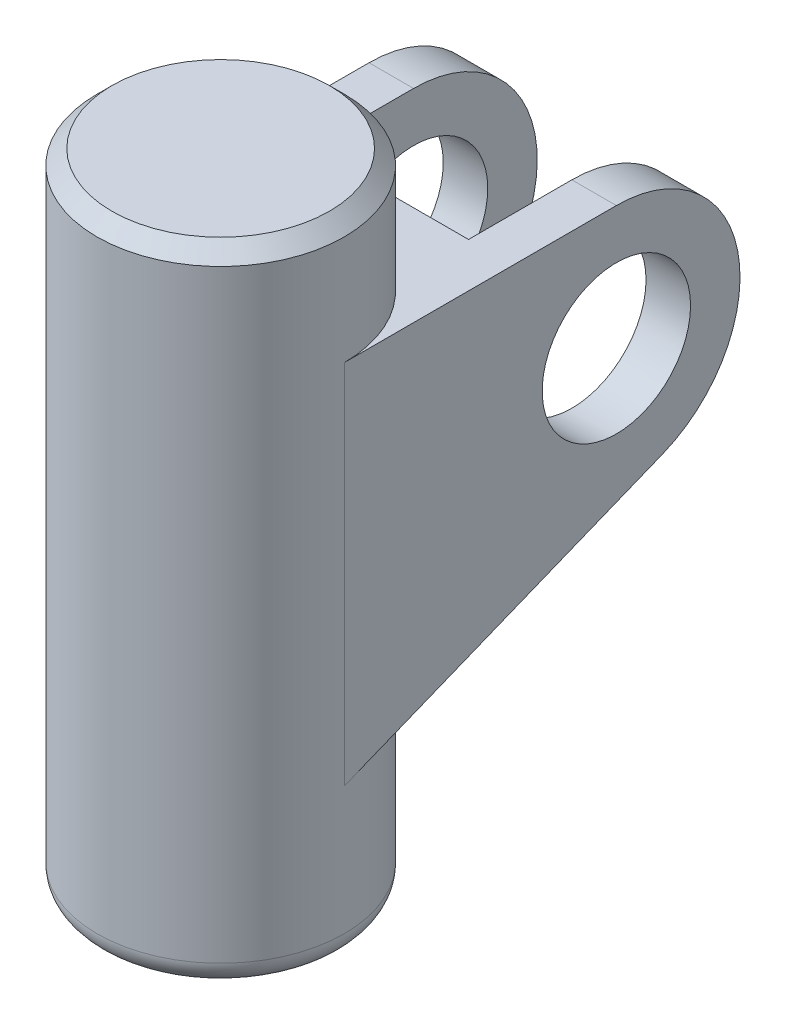
ISO-10303-21;
HEADER;
FILE_DESCRIPTION(('STEP AP214'),'2;1');
FILE_NAME('part.step','',(''),(''),'','','');
FILE_SCHEMA(('AUTOMOTIVE_DESIGN { 1 0 10303 214 1 1 1 1 }'));
ENDSEC;
DATA;
#1=APPLICATION_CONTEXT('core data for automotive mechanical design processes');
#2=APPLICATION_PROTOCOL_DEFINITION('international standard','automotive_design',2000,#1);
#3=PRODUCT_CONTEXT('',#1,'mechanical');
#4=PRODUCT('Part','Part','',(#3));
#5=PRODUCT_RELATED_PRODUCT_CATEGORY('part','',(#4));
#6=PRODUCT_DEFINITION_FORMATION('','',#4);
#7=PRODUCT_DEFINITION_CONTEXT('part definition',#1,'design');
#8=PRODUCT_DEFINITION('design','',#6,#7);
#9=PRODUCT_DEFINITION_SHAPE('','',#8);
#10=(LENGTH_UNIT() NAMED_UNIT(*) SI_UNIT(.MILLI.,.METRE.));
#11=(NAMED_UNIT(*) PLANE_ANGLE_UNIT() SI_UNIT($,.RADIAN.));
#12=(NAMED_UNIT(*) SI_UNIT($,.STERADIAN.) SOLID_ANGLE_UNIT());
#13=UNCERTAINTY_MEASURE_WITH_UNIT(LENGTH_MEASURE(1.E-05),#10,'distance_accuracy_value','');
#14=(GEOMETRIC_REPRESENTATION_CONTEXT(3) GLOBAL_UNCERTAINTY_ASSIGNED_CONTEXT((#13)) GLOBAL_UNIT_ASSIGNED_CONTEXT((#10,
#11,#12)) REPRESENTATION_CONTEXT('',''));
#15=CARTESIAN_POINT('',(0.,0.,0.));
#16=DIRECTION('',(0.,0.,1.));
#17=DIRECTION('',(1.,0.,0.));
#18=AXIS2_PLACEMENT_3D('',#15,#16,#17);
#19=CARTESIAN_POINT('',(25.,0.,0.));
#20=DIRECTION('',(-1.,0.,0.));
#21=DIRECTION('',(0.,0.,1.));
#22=AXIS2_PLACEMENT_3D('',#19,#20,#21);
#23=CYLINDRICAL_SURFACE('',#22,25.);
#24=CARTESIAN_POINT('',(16.,0.,0.));
#25=DIRECTION('',(-1.,0.,0.));
#26=DIRECTION('',(0.,0.,1.));
#27=AXIS2_PLACEMENT_3D('',#24,#25,#26);
#28=CIRCLE('',#27,25.);
#29=CARTESIAN_POINT('',(16.,25.,0.));
#30=VERTEX_POINT('',#29);
#31=CARTESIAN_POINT('',(16.,-23.1847591618842,-9.35237630794582));
#32=VERTEX_POINT('',#31);
#33=EDGE_CURVE('E50',#30,#32,#28,.T.);
#34=ORIENTED_EDGE('',*,*,#33,.F.);
#35=DIRECTION('',(-1.,0.,0.));
#36=VECTOR('',#35,1.);
#37=CARTESIAN_POINT('',(25.,25.,0.));
#38=LINE('',#37,#36);
#39=CARTESIAN_POINT('',(25.,25.,0.));
#40=VERTEX_POINT('',#39);
#41=EDGE_CURVE('E129',#40,#30,#38,.T.);
#42=ORIENTED_EDGE('',*,*,#41,.F.);
#43=CARTESIAN_POINT('',(25.,0.,0.));
#44=DIRECTION('',(1.,0.,0.));
#45=DIRECTION('',(0.,0.,1.));
#46=AXIS2_PLACEMENT_3D('',#43,#44,#45);
#47=CIRCLE('',#46,25.);
#48=CARTESIAN_POINT('',(25.,-23.1847591618842,-9.35237630794582));
#49=VERTEX_POINT('',#48);
#50=EDGE_CURVE('E158',#49,#40,#47,.T.);
#51=ORIENTED_EDGE('',*,*,#50,.F.);
#52=DIRECTION('',(-1.,0.,0.));
#53=VECTOR('',#52,1.);
#54=CARTESIAN_POINT('',(25.,-23.1847591618842,-9.35237630794582));
#55=LINE('',#54,#53);
#56=EDGE_CURVE('E171',#49,#32,#55,.T.);
#57=ORIENTED_EDGE('',*,*,#56,.T.);
#58=EDGE_LOOP('',(#34,#42,#51,#57));
#59=FACE_BOUND('',#58,.T.);
#60=ADVANCED_FACE('F35',(#59),#23,.T.);
#61=CARTESIAN_POINT('',(-30.,0.,0.));
#62=DIRECTION('',(1.,0.,0.));
#63=DIRECTION('',(0.,0.,-1.));
#64=AXIS2_PLACEMENT_3D('',#61,#62,#63);
#65=CYLINDRICAL_SURFACE('',#64,15.);
#66=CARTESIAN_POINT('',(25.,0.,0.));
#67=DIRECTION('',(1.,0.,0.));
#68=DIRECTION('',(0.,0.,-1.));
#69=AXIS2_PLACEMENT_3D('',#66,#67,#68);
#70=CIRCLE('',#69,15.);
#71=CARTESIAN_POINT('',(25.,0.,-15.));
#72=VERTEX_POINT('',#71);
#73=EDGE_CURVE('E120',#72,#72,#70,.T.);
#74=CARTESIAN_POINT('',(16.,0.,0.));
#75=DIRECTION('',(-1.,0.,0.));
#76=DIRECTION('',(0.,0.,1.));
#77=AXIS2_PLACEMENT_3D('',#74,#75,#76);
#78=CIRCLE('',#77,15.);
#79=CARTESIAN_POINT('',(16.,0.,-15.));
#80=VERTEX_POINT('',#79);
#81=EDGE_CURVE('E189',#80,#80,#78,.F.);
#82=CARTESIAN_POINT('',(25.,0.,-15.));
#83=CARTESIAN_POINT('',(24.90625,0.,-15.));
#84=CARTESIAN_POINT('',(24.8125,0.,-15.));
#85=CARTESIAN_POINT('',(24.625,0.,-15.));
#86=CARTESIAN_POINT('',(24.53125,0.,-15.));
#87=CARTESIAN_POINT('',(24.34375,0.,-15.));
#88=CARTESIAN_POINT('',(24.25,0.,-15.));
#89=CARTESIAN_POINT('',(24.0625,0.,-15.));
#90=CARTESIAN_POINT('',(23.96875,0.,-15.));
#91=CARTESIAN_POINT('',(23.78125,0.,-15.));
#92=CARTESIAN_POINT('',(23.6875,0.,-15.));
#93=CARTESIAN_POINT('',(23.5,0.,-15.));
#94=CARTESIAN_POINT('',(23.40625,0.,-15.));
#95=CARTESIAN_POINT('',(23.21875,0.,-15.));
#96=CARTESIAN_POINT('',(23.125,0.,-15.));
#97=CARTESIAN_POINT('',(22.9375,0.,-15.));
#98=CARTESIAN_POINT('',(22.84375,0.,-15.));
#99=CARTESIAN_POINT('',(22.65625,0.,-15.));
#100=CARTESIAN_POINT('',(22.5625,0.,-15.));
#101=CARTESIAN_POINT('',(22.375,0.,-15.));
#102=CARTESIAN_POINT('',(22.28125,0.,-15.));
#103=CARTESIAN_POINT('',(22.09375,0.,-15.));
#104=CARTESIAN_POINT('',(22.,0.,-15.));
#105=CARTESIAN_POINT('',(21.8125,0.,-15.));
#106=CARTESIAN_POINT('',(21.71875,0.,-15.));
#107=CARTESIAN_POINT('',(21.53125,0.,-15.));
#108=CARTESIAN_POINT('',(21.4375,0.,-15.));
#109=CARTESIAN_POINT('',(21.25,0.,-15.));
#110=CARTESIAN_POINT('',(21.15625,0.,-15.));
#111=CARTESIAN_POINT('',(20.96875,0.,-15.));
#112=CARTESIAN_POINT('',(20.875,0.,-15.));
#113=CARTESIAN_POINT('',(20.6875,0.,-15.));
#114=CARTESIAN_POINT('',(20.59375,0.,-15.));
#115=CARTESIAN_POINT('',(20.40625,0.,-15.));
#116=CARTESIAN_POINT('',(20.3125,0.,-15.));
#117=CARTESIAN_POINT('',(20.125,0.,-15.));
#118=CARTESIAN_POINT('',(20.03125,0.,-15.));
#119=CARTESIAN_POINT('',(19.84375,0.,-15.));
#120=CARTESIAN_POINT('',(19.75,0.,-15.));
#121=CARTESIAN_POINT('',(19.5625,0.,-15.));
#122=CARTESIAN_POINT('',(19.46875,0.,-15.));
#123=CARTESIAN_POINT('',(19.28125,0.,-15.));
#124=CARTESIAN_POINT('',(19.1875,0.,-15.));
#125=CARTESIAN_POINT('',(19.,0.,-15.));
#126=CARTESIAN_POINT('',(18.90625,0.,-15.));
#127=CARTESIAN_POINT('',(18.71875,0.,-15.));
#128=CARTESIAN_POINT('',(18.625,0.,-15.));
#129=CARTESIAN_POINT('',(18.4375,0.,-15.));
#130=CARTESIAN_POINT('',(18.34375,0.,-15.));
#131=CARTESIAN_POINT('',(18.15625,0.,-15.));
#132=CARTESIAN_POINT('',(18.0625,0.,-15.));
#133=CARTESIAN_POINT('',(17.875,0.,-15.));
#134=CARTESIAN_POINT('',(17.78125,0.,-15.));
#135=CARTESIAN_POINT('',(17.59375,0.,-15.));
#136=CARTESIAN_POINT('',(17.5,0.,-15.));
#137=CARTESIAN_POINT('',(17.3125,0.,-15.));
#138=CARTESIAN_POINT('',(17.21875,0.,-15.));
#139=CARTESIAN_POINT('',(17.03125,0.,-15.));
#140=CARTESIAN_POINT('',(16.9375,0.,-15.));
#141=CARTESIAN_POINT('',(16.75,0.,-15.));
#142=CARTESIAN_POINT('',(16.65625,0.,-15.));
#143=CARTESIAN_POINT('',(16.46875,0.,-15.));
#144=CARTESIAN_POINT('',(16.375,0.,-15.));
#145=CARTESIAN_POINT('',(16.1875,0.,-15.));
#146=CARTESIAN_POINT('',(16.09375,0.,-15.));
#147=CARTESIAN_POINT('',(16.,0.,-15.));
#148=B_SPLINE_CURVE_WITH_KNOTS('',3,(#82,#83,#84,#85,#86,#87,#88,#89,#90,#91,#92,#93,#94,#95,
#96,#97,#98,#99,#100,#101,#102,#103,#104,#105,#106,#107,#108,#109,#110,#111,#112,#113,#114,#115,
#116,#117,#118,#119,#120,#121,#122,#123,#124,#125,#126,#127,#128,#129,#130,#131,#132,#133,#134,
#135,#136,#137,#138,#139,#140,#141,#142,#143,#144,#145,#146,#147),.UNSPECIFIED.,.F.,.F.,(4,2,2,
2,2,2,2,2,2,2,2,2,2,2,2,2,2,2,2,2,2,2,2,2,2,2,2,2,2,2,2,2,4),(0.,0.281249999999997,0.5625,
0.843750000000004,1.125,1.40625,1.6875,1.96875000000001,2.25,2.53125,2.8125,3.09375000000001,
3.375,3.65625,3.9375,4.21875000000001,4.5,4.78125,5.0625,5.34375000000001,5.62500000000001,
5.90625,6.18750000000001,6.46875000000001,6.75000000000001,7.03125,7.31250000000001,
7.59375000000001,7.87500000000001,8.15625,8.43750000000001,8.71875000000001,9.00000000000001),.UNSPECIFIED.);
#149=EDGE_CURVE('BSEAM214',#72,#80,#148,.T.);
#150=ORIENTED_EDGE('',*,*,#73,.T.);
#151=ORIENTED_EDGE('',*,*,#81,.F.);
#152=ORIENTED_EDGE('',*,*,#149,.T.);
#153=ORIENTED_EDGE('',*,*,#149,.F.);
#154=EDGE_LOOP('',(#150,#152,#151,#153));
#155=FACE_BOUND('',#154,.T.);
#156=ADVANCED_FACE('F214',(#155),#65,.F.);
#157=CARTESIAN_POINT('',(-16.,25.,0.));
#158=VERTEX_POINT('',#157);
#159=CARTESIAN_POINT('',(-25.,25.,0.));
#160=VERTEX_POINT('',#159);
#161=EDGE_CURVE('E174',#158,#160,#38,.T.);
#162=ORIENTED_EDGE('',*,*,#161,.F.);
#163=CARTESIAN_POINT('',(-16.,0.,0.));
#164=DIRECTION('',(-1.,0.,0.));
#165=DIRECTION('',(0.,0.,1.));
#166=AXIS2_PLACEMENT_3D('',#163,#164,#165);
#167=CIRCLE('',#166,25.);
#168=CARTESIAN_POINT('',(-16.,-23.1847591618842,-9.35237630794582));
#169=VERTEX_POINT('',#168);
#170=EDGE_CURVE('E139',#158,#169,#167,.T.);
#171=ORIENTED_EDGE('',*,*,#170,.T.);
#172=CARTESIAN_POINT('',(-25.,-23.1847591618842,-9.35237630794582));
#173=VERTEX_POINT('',#172);
#174=EDGE_CURVE('E78',#169,#173,#55,.T.);
#175=ORIENTED_EDGE('',*,*,#174,.T.);
#176=CARTESIAN_POINT('',(-25.,0.,0.));
#177=DIRECTION('',(1.,0.,0.));
#178=DIRECTION('',(0.,0.,1.));
#179=AXIS2_PLACEMENT_3D('',#176,#177,#178);
#180=CIRCLE('',#179,25.);
#181=EDGE_CURVE('E157',#173,#160,#180,.T.);
#182=ORIENTED_EDGE('',*,*,#181,.T.);
#183=EDGE_LOOP('',(#162,#171,#175,#182));
#184=FACE_BOUND('',#183,.T.);
#185=ADVANCED_FACE('F206',(#184),#23,.T.);
#186=CARTESIAN_POINT('',(25.,25.,0.));
#187=DIRECTION('',(0.,-1.,0.));
#188=DIRECTION('',(0.,0.,-1.));
#189=AXIS2_PLACEMENT_3D('',#186,#187,#188);
#190=PLANE('',#189);
#191=DIRECTION('',(-1.,0.,0.));
#192=VECTOR('',#191,1.);
#193=CARTESIAN_POINT('',(25.,25.,20.8875775243555));
#194=LINE('',#193,#192);
#195=CARTESIAN_POINT('',(16.,25.,20.8875775243555));
#196=VERTEX_POINT('',#195);
#197=CARTESIAN_POINT('',(-16.,25.,20.8875775243555));
#198=VERTEX_POINT('',#197);
#199=EDGE_CURVE('E112',#196,#198,#194,.T.);
#200=ORIENTED_EDGE('',*,*,#199,.T.);
#201=DIRECTION('',(0.,0.,-1.));
#202=VECTOR('',#201,1.);
#203=CARTESIAN_POINT('',(-16.,25.,0.));
#204=LINE('',#203,#202);
#205=EDGE_CURVE('E121',#198,#158,#204,.T.);
#206=ORIENTED_EDGE('',*,*,#205,.T.);
#207=ORIENTED_EDGE('',*,*,#161,.T.);
#208=DIRECTION('',(0.,0.,1.));
#209=VECTOR('',#208,1.);
#210=CARTESIAN_POINT('',(-25.,25.,0.));
#211=LINE('',#210,#209);
#212=CARTESIAN_POINT('',(-25.,25.,55.));
#213=VERTEX_POINT('',#212);
#214=EDGE_CURVE('E166',#160,#213,#211,.T.);
#215=ORIENTED_EDGE('',*,*,#214,.T.);
#216=CARTESIAN_POINT('',(0.,25.,55.));
#217=DIRECTION('',(0.,-1.,0.));
#218=DIRECTION('',(0.,0.,-1.));
#219=AXIS2_PLACEMENT_3D('',#216,#217,#218);
#220=CIRCLE('',#219,25.);
#221=CARTESIAN_POINT('',(25.,25.,55.));
#222=VERTEX_POINT('',#221);
#223=EDGE_CURVE('E145',#222,#213,#220,.F.);
#224=ORIENTED_EDGE('',*,*,#223,.F.);
#225=DIRECTION('',(0.,0.,1.));
#226=VECTOR('',#225,1.);
#227=CARTESIAN_POINT('',(25.,25.,0.));
#228=LINE('',#227,#226);
#229=EDGE_CURVE('E86',#40,#222,#228,.T.);
#230=ORIENTED_EDGE('',*,*,#229,.F.);
#231=ORIENTED_EDGE('',*,*,#41,.T.);
#232=DIRECTION('',(0.,0.,-1.));
#233=VECTOR('',#232,1.);
#234=CARTESIAN_POINT('',(16.,25.,0.));
#235=LINE('',#234,#233);
#236=EDGE_CURVE('E124',#196,#30,#235,.T.);
#237=ORIENTED_EDGE('',*,*,#236,.F.);
#238=EDGE_LOOP('',(#200,#206,#207,#215,#224,#230,#231,#237));
#239=FACE_BOUND('',#238,.T.);
#240=ADVANCED_FACE('F127',(#239),#190,.F.);
#241=CARTESIAN_POINT('',(25.,-23.1847591618842,-9.35237630794582));
#242=DIRECTION('',(0.,0.927390366475368,0.374095052317833));
#243=DIRECTION('',(0.,-0.374095052317833,0.927390366475368));
#244=AXIS2_PLACEMENT_3D('',#241,#242,#243);
#245=PLANE('',#244);
#246=ORIENTED_EDGE('',*,*,#174,.F.);
#247=DIRECTION('',(0.,-0.374095052317833,0.927390366475368));
#248=VECTOR('',#247,1.);
#249=CARTESIAN_POINT('',(-16.,-23.1847591618842,-9.35237630794582));
#250=LINE('',#249,#248);
#251=CARTESIAN_POINT('',(-16.,-35.3830928085645,20.8875775243556));
#252=VERTEX_POINT('',#251);
#253=EDGE_CURVE('E133',#169,#252,#250,.T.);
#254=ORIENTED_EDGE('',*,*,#253,.T.);
#255=DIRECTION('',(1.,0.,0.));
#256=VECTOR('',#255,1.);
#257=CARTESIAN_POINT('',(25.,-35.3830928085645,20.8875775243556));
#258=LINE('',#257,#256);
#259=CARTESIAN_POINT('',(16.,-35.3830928085645,20.8875775243556));
#260=VERTEX_POINT('',#259);
#261=EDGE_CURVE('E11',#252,#260,#258,.T.);
#262=ORIENTED_EDGE('',*,*,#261,.T.);
#263=DIRECTION('',(0.,-0.374095052317833,0.927390366475368));
#264=VECTOR('',#263,1.);
#265=CARTESIAN_POINT('',(16.,-23.1847591618842,-9.35237630794582));
#266=LINE('',#265,#264);
#267=EDGE_CURVE('E125',#32,#260,#266,.T.);
#268=ORIENTED_EDGE('',*,*,#267,.F.);
#269=ORIENTED_EDGE('',*,*,#56,.F.);
#270=DIRECTION('',(0.,0.374095052317833,-0.927390366475368));
#271=VECTOR('',#270,1.);
#272=CARTESIAN_POINT('',(25.,-23.1847591618842,-9.35237630794582));
#273=LINE('',#272,#271);
#274=CARTESIAN_POINT('',(25.,-49.1435209217167,55.));
#275=VERTEX_POINT('',#274);
#276=EDGE_CURVE('E59',#275,#49,#273,.T.);
#277=ORIENTED_EDGE('',*,*,#276,.F.);
#278=CARTESIAN_POINT('',(0.,-49.1435209217167,55.));
#279=DIRECTION('',(0.,0.927390366475368,0.374095052317833));
#280=DIRECTION('',(0.,0.374095052317833,-0.927390366475368));
#281=AXIS2_PLACEMENT_3D('',#278,#279,#280);
#282=ELLIPSE('',#281,26.9573643459494,25.);
#283=CARTESIAN_POINT('',(-25.,-49.1435209217167,55.));
#284=VERTEX_POINT('',#283);
#285=EDGE_CURVE('E152',#275,#284,#282,.T.);
#286=ORIENTED_EDGE('',*,*,#285,.T.);
#287=DIRECTION('',(0.,0.374095052317833,-0.927390366475368));
#288=VECTOR('',#287,1.);
#289=CARTESIAN_POINT('',(-25.,-23.1847591618842,-9.35237630794582));
#290=LINE('',#289,#288);
#291=EDGE_CURVE('E160',#284,#173,#290,.T.);
#292=ORIENTED_EDGE('',*,*,#291,.T.);
#293=EDGE_LOOP('',(#246,#254,#262,#268,#269,#277,#286,#292));
#294=FACE_BOUND('',#293,.T.);
#295=ADVANCED_FACE('F197',(#294),#245,.F.);
#296=CARTESIAN_POINT('',(25.,0.,0.));
#297=DIRECTION('',(-1.,0.,0.));
#298=DIRECTION('',(0.,0.,1.));
#299=AXIS2_PLACEMENT_3D('',#296,#297,#298);
#300=PLANE('',#299);
#301=ORIENTED_EDGE('',*,*,#73,.F.);
#302=EDGE_LOOP('',(#301));
#303=FACE_BOUND('',#302,.T.);
#304=ORIENTED_EDGE('',*,*,#50,.T.);
#305=ORIENTED_EDGE('',*,*,#229,.T.);
#306=DIRECTION('',(0.,-1.,0.));
#307=VECTOR('',#306,1.);
#308=CARTESIAN_POINT('',(25.,25.,55.));
#309=LINE('',#308,#307);
#310=EDGE_CURVE('E162',#222,#275,#309,.T.);
#311=ORIENTED_EDGE('',*,*,#310,.T.);
#312=ORIENTED_EDGE('',*,*,#276,.T.);
#313=EDGE_LOOP('',(#304,#305,#311,#312));
#314=FACE_BOUND('',#313,.T.);
#315=ADVANCED_FACE('F210',(#303,#314),#300,.F.);
#316=CARTESIAN_POINT('',(-25.,0.,0.));
#317=DIRECTION('',(-1.,0.,0.));
#318=DIRECTION('',(0.,0.,1.));
#319=AXIS2_PLACEMENT_3D('',#316,#317,#318);
#320=PLANE('',#319);
#321=CARTESIAN_POINT('',(-25.,0.,0.));
#322=DIRECTION('',(-1.,0.,0.));
#323=DIRECTION('',(0.,0.,1.));
#324=AXIS2_PLACEMENT_3D('',#321,#322,#323);
#325=CIRCLE('',#324,15.);
#326=CARTESIAN_POINT('',(-25.,0.,-15.));
#327=VERTEX_POINT('',#326);
#328=EDGE_CURVE('E144',#327,#327,#325,.T.);
#329=ORIENTED_EDGE('',*,*,#328,.F.);
#330=EDGE_LOOP('',(#329));
#331=FACE_BOUND('',#330,.T.);
#332=ORIENTED_EDGE('',*,*,#181,.F.);
#333=ORIENTED_EDGE('',*,*,#291,.F.);
#334=DIRECTION('',(0.,-1.,0.));
#335=VECTOR('',#334,1.);
#336=CARTESIAN_POINT('',(-25.,25.,55.));
#337=LINE('',#336,#335);
#338=EDGE_CURVE('E168',#213,#284,#337,.T.);
#339=ORIENTED_EDGE('',*,*,#338,.F.);
#340=ORIENTED_EDGE('',*,*,#214,.F.);
#341=EDGE_LOOP('',(#332,#333,#339,#340));
#342=FACE_BOUND('',#341,.T.);
#343=ADVANCED_FACE('F204',(#331,#342),#320,.T.);
#344=CARTESIAN_POINT('',(0.,-80.,55.));
#345=DIRECTION('',(0.,1.,0.));
#346=DIRECTION('',(0.,0.,1.));
#347=AXIS2_PLACEMENT_3D('',#344,#345,#346);
#348=CYLINDRICAL_SURFACE('',#347,25.);
#349=CARTESIAN_POINT('',(0.,47.,55.));
#350=DIRECTION('',(0.,1.,0.));
#351=DIRECTION('',(0.,0.,1.));
#352=AXIS2_PLACEMENT_3D('',#349,#350,#351);
#353=CIRCLE('',#352,25.);
#354=CARTESIAN_POINT('',(0.,47.,80.));
#355=VERTEX_POINT('',#354);
#356=EDGE_CURVE('E43',#355,#355,#353,.F.);
#357=ORIENTED_EDGE('',*,*,#356,.T.);
#358=EDGE_LOOP('',(#357));
#359=FACE_BOUND('',#358,.T.);
#360=CARTESIAN_POINT('',(0.,-75.,55.));
#361=DIRECTION('',(0.,1.,0.));
#362=DIRECTION('',(0.,0.,1.));
#363=AXIS2_PLACEMENT_3D('',#360,#361,#362);
#364=CIRCLE('',#363,25.);
#365=CARTESIAN_POINT('',(0.,-75.,80.));
#366=VERTEX_POINT('',#365);
#367=EDGE_CURVE('E176',#366,#366,#364,.T.);
#368=ORIENTED_EDGE('',*,*,#367,.T.);
#369=EDGE_LOOP('',(#368));
#370=FACE_BOUND('',#369,.T.);
#371=ORIENTED_EDGE('',*,*,#285,.F.);
#372=ORIENTED_EDGE('',*,*,#310,.F.);
#373=ORIENTED_EDGE('',*,*,#223,.T.);
#374=ORIENTED_EDGE('',*,*,#338,.T.);
#375=EDGE_LOOP('',(#371,#372,#373,#374));
#376=FACE_BOUND('',#375,.T.);
#377=ADVANCED_FACE('F209',(#359,#370,#376),#348,.T.);
#378=CARTESIAN_POINT('',(0.,-80.,55.));
#379=DIRECTION('',(0.,1.,0.));
#380=DIRECTION('',(0.,0.,1.));
#381=AXIS2_PLACEMENT_3D('',#378,#379,#380);
#382=PLANE('',#381);
#383=CARTESIAN_POINT('',(0.,-80.,55.));
#384=DIRECTION('',(0.,-1.,0.));
#385=DIRECTION('',(0.,0.,-1.));
#386=AXIS2_PLACEMENT_3D('',#383,#384,#385);
#387=CIRCLE('',#386,15.);
#388=CARTESIAN_POINT('',(0.,-80.,40.));
#389=VERTEX_POINT('',#388);
#390=EDGE_CURVE('E148',#389,#389,#387,.T.);
#391=ORIENTED_EDGE('',*,*,#390,.F.);
#392=EDGE_LOOP('',(#391));
#393=FACE_BOUND('',#392,.T.);
#394=CARTESIAN_POINT('',(0.,-80.,55.));
#395=DIRECTION('',(0.,1.,0.));
#396=DIRECTION('',(0.,0.,1.));
#397=AXIS2_PLACEMENT_3D('',#394,#395,#396);
#398=CIRCLE('',#397,20.);
#399=CARTESIAN_POINT('',(0.,-80.,75.));
#400=VERTEX_POINT('',#399);
#401=EDGE_CURVE('E179',#400,#400,#398,.F.);
#402=ORIENTED_EDGE('',*,*,#401,.T.);
#403=EDGE_LOOP('',(#402));
#404=FACE_BOUND('',#403,.T.);
#405=ADVANCED_FACE('F240',(#393,#404),#382,.F.);
#406=CARTESIAN_POINT('',(0.,-75.,55.));
#407=DIRECTION('',(0.,1.,0.));
#408=DIRECTION('',(0.,0.,1.));
#409=AXIS2_PLACEMENT_3D('',#406,#407,#408);
#410=TOROIDAL_SURFACE('',#409,20.,5.);
#411=ORIENTED_EDGE('',*,*,#401,.F.);
#412=EDGE_LOOP('',(#411));
#413=FACE_BOUND('',#412,.T.);
#414=ORIENTED_EDGE('',*,*,#367,.F.);
#415=EDGE_LOOP('',(#414));
#416=FACE_BOUND('',#415,.T.);
#417=ADVANCED_FACE('F244',(#413,#416),#410,.T.);
#418=CARTESIAN_POINT('',(0.,0.,55.));
#419=DIRECTION('',(0.,-1.,0.));
#420=DIRECTION('',(0.,0.,-1.));
#421=AXIS2_PLACEMENT_3D('',#418,#419,#420);
#422=PLANE('',#421);
#423=CARTESIAN_POINT('',(0.,0.,55.));
#424=DIRECTION('',(0.,-1.,0.));
#425=DIRECTION('',(0.,0.,-1.));
#426=AXIS2_PLACEMENT_3D('',#423,#424,#425);
#427=CIRCLE('',#426,15.);
#428=CARTESIAN_POINT('',(0.,0.,40.));
#429=VERTEX_POINT('',#428);
#430=EDGE_CURVE('E149',#429,#429,#427,.T.);
#431=ORIENTED_EDGE('',*,*,#430,.T.);
#432=EDGE_LOOP('',(#431));
#433=FACE_BOUND('',#432,.T.);
#434=ADVANCED_FACE('F250',(#433),#422,.T.);
#435=CARTESIAN_POINT('',(0.,0.,55.));
#436=DIRECTION('',(0.,-1.,0.));
#437=DIRECTION('',(0.,0.,-1.));
#438=AXIS2_PLACEMENT_3D('',#435,#436,#437);
#439=CYLINDRICAL_SURFACE('',#438,15.);
#440=ORIENTED_EDGE('',*,*,#430,.F.);
#441=EDGE_LOOP('',(#440));
#442=FACE_BOUND('',#441,.T.);
#443=ORIENTED_EDGE('',*,*,#390,.T.);
#444=EDGE_LOOP('',(#443));
#445=FACE_BOUND('',#444,.T.);
#446=ADVANCED_FACE('F246',(#442,#445),#439,.F.);
#447=CARTESIAN_POINT('',(0.,50.,55.));
#448=DIRECTION('',(0.,1.,0.));
#449=DIRECTION('',(0.,0.,1.));
#450=AXIS2_PLACEMENT_3D('',#447,#448,#449);
#451=PLANE('',#450);
#452=CARTESIAN_POINT('',(0.,50.,55.));
#453=DIRECTION('',(0.,1.,0.));
#454=DIRECTION('',(0.,0.,1.));
#455=AXIS2_PLACEMENT_3D('',#452,#453,#454);
#456=CIRCLE('',#455,22.);
#457=CARTESIAN_POINT('',(0.,50.,77.));
#458=VERTEX_POINT('',#457);
#459=EDGE_CURVE('E182',#458,#458,#456,.T.);
#460=ORIENTED_EDGE('',*,*,#459,.T.);
#461=EDGE_LOOP('',(#460));
#462=FACE_BOUND('',#461,.T.);
#463=ADVANCED_FACE('F249',(#462),#451,.T.);
#464=CARTESIAN_POINT('',(0.,50.,55.));
#465=DIRECTION('',(0.,-1.,0.));
#466=DIRECTION('',(0.,0.,-1.));
#467=AXIS2_PLACEMENT_3D('',#464,#465,#466);
#468=CONICAL_SURFACE('',#467,22.,0.785398163397448);
#469=ORIENTED_EDGE('',*,*,#356,.F.);
#470=EDGE_LOOP('',(#469));
#471=FACE_BOUND('',#470,.T.);
#472=ORIENTED_EDGE('',*,*,#459,.F.);
#473=EDGE_LOOP('',(#472));
#474=FACE_BOUND('',#473,.T.);
#475=ADVANCED_FACE('F37',(#471,#474),#468,.T.);
#476=CARTESIAN_POINT('',(-16.,0.,0.));
#477=DIRECTION('',(-1.,0.,0.));
#478=DIRECTION('',(0.,0.,1.));
#479=AXIS2_PLACEMENT_3D('',#476,#477,#478);
#480=CIRCLE('',#479,15.);
#481=CARTESIAN_POINT('',(-16.,0.,-15.));
#482=VERTEX_POINT('',#481);
#483=EDGE_CURVE('E130',#482,#482,#480,.F.);
#484=CARTESIAN_POINT('',(-16.,0.,-15.));
#485=CARTESIAN_POINT('',(-16.09375,0.,-15.));
#486=CARTESIAN_POINT('',(-16.1875,0.,-15.));
#487=CARTESIAN_POINT('',(-16.375,0.,-15.));
#488=CARTESIAN_POINT('',(-16.46875,0.,-15.));
#489=CARTESIAN_POINT('',(-16.65625,0.,-15.));
#490=CARTESIAN_POINT('',(-16.75,0.,-15.));
#491=CARTESIAN_POINT('',(-16.9375,0.,-15.));
#492=CARTESIAN_POINT('',(-17.03125,0.,-15.));
#493=CARTESIAN_POINT('',(-17.21875,0.,-15.));
#494=CARTESIAN_POINT('',(-17.3125,0.,-15.));
#495=CARTESIAN_POINT('',(-17.5,0.,-15.));
#496=CARTESIAN_POINT('',(-17.59375,0.,-15.));
#497=CARTESIAN_POINT('',(-17.78125,0.,-15.));
#498=CARTESIAN_POINT('',(-17.875,0.,-15.));
#499=CARTESIAN_POINT('',(-18.0625,0.,-15.));
#500=CARTESIAN_POINT('',(-18.15625,0.,-15.));
#501=CARTESIAN_POINT('',(-18.34375,0.,-15.));
#502=CARTESIAN_POINT('',(-18.4375,0.,-15.));
#503=CARTESIAN_POINT('',(-18.625,0.,-15.));
#504=CARTESIAN_POINT('',(-18.71875,0.,-15.));
#505=CARTESIAN_POINT('',(-18.90625,0.,-15.));
#506=CARTESIAN_POINT('',(-19.,0.,-15.));
#507=CARTESIAN_POINT('',(-19.1875,0.,-15.));
#508=CARTESIAN_POINT('',(-19.28125,0.,-15.));
#509=CARTESIAN_POINT('',(-19.46875,0.,-15.));
#510=CARTESIAN_POINT('',(-19.5625,0.,-15.));
#511=CARTESIAN_POINT('',(-19.75,0.,-15.));
#512=CARTESIAN_POINT('',(-19.84375,0.,-15.));
#513=CARTESIAN_POINT('',(-20.03125,0.,-15.));
#514=CARTESIAN_POINT('',(-20.125,0.,-15.));
#515=CARTESIAN_POINT('',(-20.3125,0.,-15.));
#516=CARTESIAN_POINT('',(-20.40625,0.,-15.));
#517=CARTESIAN_POINT('',(-20.59375,0.,-15.));
#518=CARTESIAN_POINT('',(-20.6875,0.,-15.));
#519=CARTESIAN_POINT('',(-20.875,0.,-15.));
#520=CARTESIAN_POINT('',(-20.96875,0.,-15.));
#521=CARTESIAN_POINT('',(-21.15625,0.,-15.));
#522=CARTESIAN_POINT('',(-21.25,0.,-15.));
#523=CARTESIAN_POINT('',(-21.4375,0.,-15.));
#524=CARTESIAN_POINT('',(-21.53125,0.,-15.));
#525=CARTESIAN_POINT('',(-21.71875,0.,-15.));
#526=CARTESIAN_POINT('',(-21.8125,0.,-15.));
#527=CARTESIAN_POINT('',(-22.,0.,-15.));
#528=CARTESIAN_POINT('',(-22.09375,0.,-15.));
#529=CARTESIAN_POINT('',(-22.28125,0.,-15.));
#530=CARTESIAN_POINT('',(-22.375,0.,-15.));
#531=CARTESIAN_POINT('',(-22.5625,0.,-15.));
#532=CARTESIAN_POINT('',(-22.65625,0.,-15.));
#533=CARTESIAN_POINT('',(-22.84375,0.,-15.));
#534=CARTESIAN_POINT('',(-22.9375,0.,-15.));
#535=CARTESIAN_POINT('',(-23.125,0.,-15.));
#536=CARTESIAN_POINT('',(-23.21875,0.,-15.));
#537=CARTESIAN_POINT('',(-23.40625,0.,-15.));
#538=CARTESIAN_POINT('',(-23.5,0.,-15.));
#539=CARTESIAN_POINT('',(-23.6875,0.,-15.));
#540=CARTESIAN_POINT('',(-23.78125,0.,-15.));
#541=CARTESIAN_POINT('',(-23.96875,0.,-15.));
#542=CARTESIAN_POINT('',(-24.0625,0.,-15.));
#543=CARTESIAN_POINT('',(-24.25,0.,-15.));
#544=CARTESIAN_POINT('',(-24.34375,0.,-15.));
#545=CARTESIAN_POINT('',(-24.53125,0.,-15.));
#546=CARTESIAN_POINT('',(-24.625,0.,-15.));
#547=CARTESIAN_POINT('',(-24.8125,0.,-15.));
#548=CARTESIAN_POINT('',(-24.90625,0.,-15.));
#549=CARTESIAN_POINT('',(-25.,0.,-15.));
#550=B_SPLINE_CURVE_WITH_KNOTS('',3,(#484,#485,#486,#487,#488,#489,#490,#491,#492,#493,#494,
#495,#496,#497,#498,#499,#500,#501,#502,#503,#504,#505,#506,#507,#508,#509,#510,#511,#512,#513,
#514,#515,#516,#517,#518,#519,#520,#521,#522,#523,#524,#525,#526,#527,#528,#529,#530,#531,#532,
#533,#534,#535,#536,#537,#538,#539,#540,#541,#542,#543,#544,#545,#546,#547,#548,#549),
.UNSPECIFIED.,.F.,.F.,(4,2,2,2,2,2,2,2,2,2,2,2,2,2,2,2,2,2,2,2,2,2,2,2,2,2,2,2,2,2,2,2,4),(0.,
0.281249999999997,0.5625,0.843750000000001,1.125,1.40625,1.6875,1.96875000000001,2.25,
2.53125000000001,2.8125,3.09375000000001,3.37500000000001,3.65625000000001,3.93750000000001,
4.21875000000001,4.50000000000001,4.78125000000001,5.06250000000001,5.34375000000001,
5.62500000000001,5.90625000000001,6.18750000000001,6.46875000000001,6.75000000000001,
7.03125000000001,7.31250000000001,7.59375000000002,7.87500000000002,8.15625000000002,
8.43750000000002,8.71875000000002,9.00000000000002),.UNSPECIFIED.);
#551=EDGE_CURVE('BSEAM221',#482,#327,#550,.T.);
#552=ORIENTED_EDGE('',*,*,#483,.T.);
#553=ORIENTED_EDGE('',*,*,#328,.T.);
#554=ORIENTED_EDGE('',*,*,#551,.T.);
#555=ORIENTED_EDGE('',*,*,#551,.F.);
#556=EDGE_LOOP('',(#552,#554,#553,#555));
#557=FACE_BOUND('',#556,.T.);
#558=ADVANCED_FACE('F221',(#557),#65,.F.);
#559=CARTESIAN_POINT('',(-16.,-38.8031002485327,20.8875775243555));
#560=DIRECTION('',(0.,0.,1.));
#561=DIRECTION('',(1.,0.,0.));
#562=AXIS2_PLACEMENT_3D('',#559,#560,#561);
#563=PLANE('',#562);
#564=DIRECTION('',(0.,-1.,0.));
#565=VECTOR('',#564,1.);
#566=CARTESIAN_POINT('',(16.,-38.8031002485327,20.8875775243555));
#567=LINE('',#566,#565);
#568=EDGE_CURVE('E115',#196,#260,#567,.T.);
#569=ORIENTED_EDGE('',*,*,#568,.T.);
#570=ORIENTED_EDGE('',*,*,#261,.F.);
#571=DIRECTION('',(0.,-1.,0.));
#572=VECTOR('',#571,1.);
#573=CARTESIAN_POINT('',(-16.,-38.8031002485327,20.8875775243555));
#574=LINE('',#573,#572);
#575=EDGE_CURVE('E117',#198,#252,#574,.T.);
#576=ORIENTED_EDGE('',*,*,#575,.F.);
#577=ORIENTED_EDGE('',*,*,#199,.F.);
#578=EDGE_LOOP('',(#569,#570,#576,#577));
#579=FACE_BOUND('',#578,.T.);
#580=ADVANCED_FACE('F114',(#579),#563,.F.);
#581=CARTESIAN_POINT('',(-16.,0.,0.));
#582=DIRECTION('',(-1.,0.,0.));
#583=DIRECTION('',(0.,0.,1.));
#584=AXIS2_PLACEMENT_3D('',#581,#582,#583);
#585=PLANE('',#584);
#586=ORIENTED_EDGE('',*,*,#483,.F.);
#587=EDGE_LOOP('',(#586));
#588=FACE_BOUND('',#587,.T.);
#589=ORIENTED_EDGE('',*,*,#575,.T.);
#590=ORIENTED_EDGE('',*,*,#253,.F.);
#591=ORIENTED_EDGE('',*,*,#170,.F.);
#592=ORIENTED_EDGE('',*,*,#205,.F.);
#593=EDGE_LOOP('',(#589,#590,#591,#592));
#594=FACE_BOUND('',#593,.T.);
#595=ADVANCED_FACE('F195',(#588,#594),#585,.F.);
#596=CARTESIAN_POINT('',(16.,0.,0.));
#597=DIRECTION('',(-1.,0.,0.));
#598=DIRECTION('',(0.,0.,1.));
#599=AXIS2_PLACEMENT_3D('',#596,#597,#598);
#600=PLANE('',#599);
#601=ORIENTED_EDGE('',*,*,#81,.T.);
#602=EDGE_LOOP('',(#601));
#603=FACE_BOUND('',#602,.T.);
#604=ORIENTED_EDGE('',*,*,#236,.T.);
#605=ORIENTED_EDGE('',*,*,#33,.T.);
#606=ORIENTED_EDGE('',*,*,#267,.T.);
#607=ORIENTED_EDGE('',*,*,#568,.F.);
#608=EDGE_LOOP('',(#604,#605,#606,#607));
#609=FACE_BOUND('',#608,.T.);
#610=ADVANCED_FACE('F123',(#603,#609),#600,.T.);
#611=CLOSED_SHELL('',(#60,#156,#185,#240,#295,#315,#343,#377,#405,#417,#434,#446,#463,#475,#558,
#580,#595,#610));
#612=MANIFOLD_SOLID_BREP('B2',#611);
#613=ADVANCED_BREP_SHAPE_REPRESENTATION('',(#18,#612),#14);
#614=SHAPE_DEFINITION_REPRESENTATION(#9,#613);
ENDSEC;
END-ISO-10303-21;
